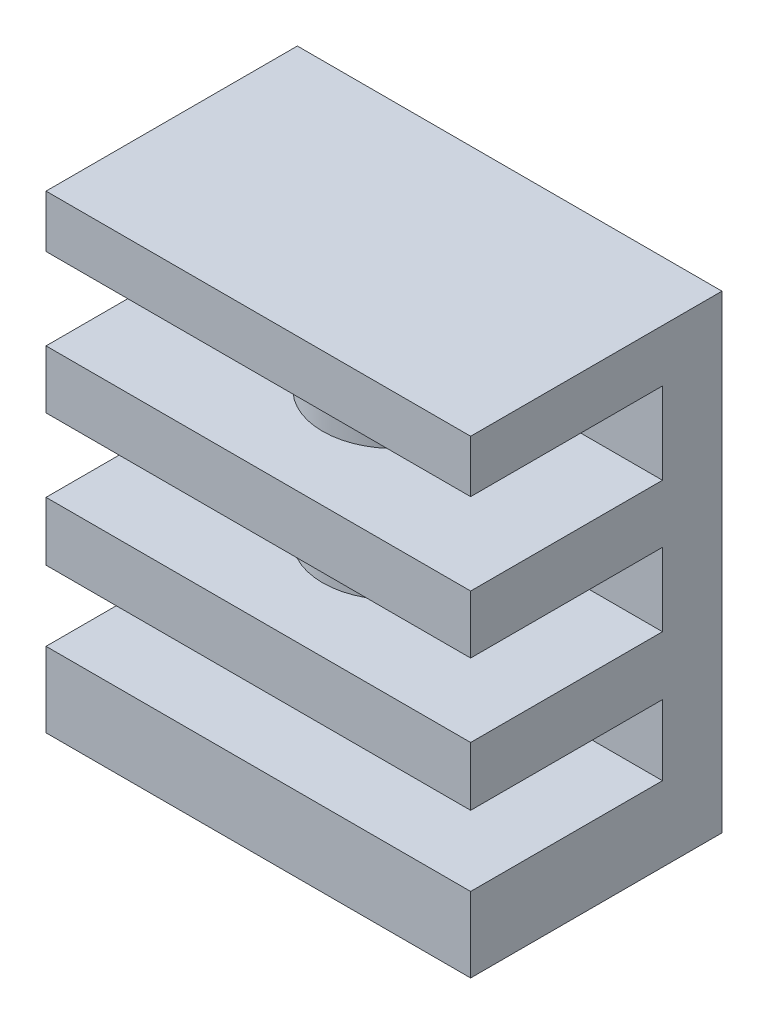
ISO-10303-21;
HEADER;
FILE_DESCRIPTION(('STEP AP214'),'2;1');
FILE_NAME('part.step','',(''),(''),'','','');
FILE_SCHEMA(('AUTOMOTIVE_DESIGN { 1 0 10303 214 1 1 1 1 }'));
ENDSEC;
DATA;
#1=APPLICATION_CONTEXT('core data for automotive mechanical design processes');
#2=APPLICATION_PROTOCOL_DEFINITION('international standard','automotive_design',2000,#1);
#3=PRODUCT_CONTEXT('',#1,'mechanical');
#4=PRODUCT('Part','Part','',(#3));
#5=PRODUCT_RELATED_PRODUCT_CATEGORY('part','',(#4));
#6=PRODUCT_DEFINITION_FORMATION('','',#4);
#7=PRODUCT_DEFINITION_CONTEXT('part definition',#1,'design');
#8=PRODUCT_DEFINITION('design','',#6,#7);
#9=PRODUCT_DEFINITION_SHAPE('','',#8);
#10=(LENGTH_UNIT() NAMED_UNIT(*) SI_UNIT(.MILLI.,.METRE.));
#11=(NAMED_UNIT(*) PLANE_ANGLE_UNIT() SI_UNIT($,.RADIAN.));
#12=(NAMED_UNIT(*) SI_UNIT($,.STERADIAN.) SOLID_ANGLE_UNIT());
#13=UNCERTAINTY_MEASURE_WITH_UNIT(LENGTH_MEASURE(1.E-05),#10,'distance_accuracy_value','');
#14=(GEOMETRIC_REPRESENTATION_CONTEXT(3) GLOBAL_UNCERTAINTY_ASSIGNED_CONTEXT((#13)) GLOBAL_UNIT_ASSIGNED_CONTEXT((#10,
#11,#12)) REPRESENTATION_CONTEXT('',''));
#15=CARTESIAN_POINT('',(0.,0.,0.));
#16=DIRECTION('',(0.,0.,1.));
#17=DIRECTION('',(1.,0.,0.));
#18=AXIS2_PLACEMENT_3D('',#15,#16,#17);
#19=CARTESIAN_POINT('',(50.,98.1729716189501,-45.177222912312));
#20=DIRECTION('',(0.,0.,-1.));
#21=DIRECTION('',(-1.,0.,0.));
#22=AXIS2_PLACEMENT_3D('',#19,#20,#21);
#23=PLANE('',#22);
#24=DIRECTION('',(-1.,0.,0.));
#25=VECTOR('',#24,1.);
#26=CARTESIAN_POINT('',(50.,78.9291415262313,-45.177222912312));
#27=LINE('',#26,#25);
#28=CARTESIAN_POINT('',(-10.5940601891332,78.9291415262313,-45.177222912312));
#29=VERTEX_POINT('',#28);
#30=CARTESIAN_POINT('',(-50.,78.9291415262313,-45.177222912312));
#31=VERTEX_POINT('',#30);
#32=EDGE_CURVE('E219',#29,#31,#27,.T.);
#33=ORIENTED_EDGE('',*,*,#32,.F.);
#34=DIRECTION('',(0.,1.,0.));
#35=VECTOR('',#34,1.);
#36=CARTESIAN_POINT('',(-10.5940601891332,48.0377300616038,-45.177222912312));
#37=LINE('',#36,#35);
#38=CARTESIAN_POINT('',(-10.5940601891332,98.1729716189501,-45.177222912312));
#39=VERTEX_POINT('',#38);
#40=EDGE_CURVE('E59',#29,#39,#37,.T.);
#41=ORIENTED_EDGE('',*,*,#40,.T.);
#42=DIRECTION('',(-1.,0.,0.));
#43=VECTOR('',#42,1.);
#44=CARTESIAN_POINT('',(50.,98.1729716189501,-45.177222912312));
#45=LINE('',#44,#43);
#46=CARTESIAN_POINT('',(-50.,98.1729716189501,-45.177222912312));
#47=VERTEX_POINT('',#46);
#48=EDGE_CURVE('E224',#39,#47,#45,.T.);
#49=ORIENTED_EDGE('',*,*,#48,.T.);
#50=DIRECTION('',(0.,-1.,0.));
#51=VECTOR('',#50,1.);
#52=CARTESIAN_POINT('',(-50.,98.1729716189501,-45.177222912312));
#53=LINE('',#52,#51);
#54=EDGE_CURVE('E288',#47,#31,#53,.T.);
#55=ORIENTED_EDGE('',*,*,#54,.T.);
#56=EDGE_LOOP('',(#33,#41,#49,#55));
#57=FACE_BOUND('',#56,.T.);
#58=ADVANCED_FACE('F43',(#57),#23,.F.);
#59=CARTESIAN_POINT('',(50.,65.2558938287732,-45.177222912312));
#60=DIRECTION('',(0.,0.,-1.));
#61=DIRECTION('',(-1.,0.,0.));
#62=AXIS2_PLACEMENT_3D('',#59,#60,#61);
#63=PLANE('',#62);
#64=DIRECTION('',(-1.,0.,0.));
#65=VECTOR('',#64,1.);
#66=CARTESIAN_POINT('',(50.,48.0377300616038,-45.177222912312));
#67=LINE('',#66,#65);
#68=CARTESIAN_POINT('',(-10.5940601891332,48.0377300616038,-45.177222912312));
#69=VERTEX_POINT('',#68);
#70=CARTESIAN_POINT('',(-50.,48.0377300616038,-45.177222912312));
#71=VERTEX_POINT('',#70);
#72=EDGE_CURVE('E201',#69,#71,#67,.T.);
#73=ORIENTED_EDGE('',*,*,#72,.F.);
#74=DIRECTION('',(0.,1.,0.));
#75=VECTOR('',#74,1.);
#76=CARTESIAN_POINT('',(-10.5940601891332,48.0377300616038,-45.177222912312));
#77=LINE('',#76,#75);
#78=CARTESIAN_POINT('',(-10.5940601891332,65.2558938287732,-45.177222912312));
#79=VERTEX_POINT('',#78);
#80=EDGE_CURVE('E67',#69,#79,#77,.T.);
#81=ORIENTED_EDGE('',*,*,#80,.T.);
#82=DIRECTION('',(-1.,0.,0.));
#83=VECTOR('',#82,1.);
#84=CARTESIAN_POINT('',(50.,65.2558938287732,-45.177222912312));
#85=LINE('',#84,#83);
#86=CARTESIAN_POINT('',(-50.,65.2558938287732,-45.177222912312));
#87=VERTEX_POINT('',#86);
#88=EDGE_CURVE('E200',#79,#87,#85,.T.);
#89=ORIENTED_EDGE('',*,*,#88,.T.);
#90=DIRECTION('',(0.,-1.,0.));
#91=VECTOR('',#90,1.);
#92=CARTESIAN_POINT('',(-50.,65.2558938287732,-45.177222912312));
#93=LINE('',#92,#91);
#94=EDGE_CURVE('E302',#87,#71,#93,.T.);
#95=ORIENTED_EDGE('',*,*,#94,.T.);
#96=EDGE_LOOP('',(#73,#81,#89,#95));
#97=FACE_BOUND('',#96,.T.);
#98=ADVANCED_FACE('F416',(#97),#63,.F.);
#99=CARTESIAN_POINT('',(50.,17.6527351783636,0.));
#100=DIRECTION('',(0.,0.,-1.));
#101=DIRECTION('',(-1.,0.,0.));
#102=AXIS2_PLACEMENT_3D('',#99,#100,#101);
#103=PLANE('',#102);
#104=DIRECTION('',(0.,-1.,0.));
#105=VECTOR('',#104,1.);
#106=CARTESIAN_POINT('',(-50.,17.6527351783636,0.));
#107=LINE('',#106,#105);
#108=CARTESIAN_POINT('',(-50.,17.6527351783636,0.));
#109=VERTEX_POINT('',#108);
#110=CARTESIAN_POINT('',(-50.,0.,0.));
#111=VERTEX_POINT('',#110);
#112=EDGE_CURVE('E258',#109,#111,#107,.T.);
#113=ORIENTED_EDGE('',*,*,#112,.T.);
#114=DIRECTION('',(-1.,0.,0.));
#115=VECTOR('',#114,1.);
#116=CARTESIAN_POINT('',(50.,0.,0.));
#117=LINE('',#116,#115);
#118=CARTESIAN_POINT('',(50.,0.,0.));
#119=VERTEX_POINT('',#118);
#120=EDGE_CURVE('E52',#119,#111,#117,.T.);
#121=ORIENTED_EDGE('',*,*,#120,.F.);
#122=DIRECTION('',(0.,-1.,0.));
#123=VECTOR('',#122,1.);
#124=CARTESIAN_POINT('',(50.,17.6527351783636,0.));
#125=LINE('',#124,#123);
#126=CARTESIAN_POINT('',(50.,17.6527351783636,0.));
#127=VERTEX_POINT('',#126);
#128=EDGE_CURVE('E321',#127,#119,#125,.T.);
#129=ORIENTED_EDGE('',*,*,#128,.F.);
#130=DIRECTION('',(-1.,0.,0.));
#131=VECTOR('',#130,1.);
#132=CARTESIAN_POINT('',(50.,17.6527351783636,0.));
#133=LINE('',#132,#131);
#134=EDGE_CURVE('E260',#127,#109,#133,.T.);
#135=ORIENTED_EDGE('',*,*,#134,.T.);
#136=EDGE_LOOP('',(#113,#121,#129,#135));
#137=FACE_BOUND('',#136,.T.);
#138=ADVANCED_FACE('F45',(#137),#103,.F.);
#139=CARTESIAN_POINT('',(50.,0.,0.));
#140=DIRECTION('',(0.,1.,0.));
#141=DIRECTION('',(0.,0.,1.));
#142=AXIS2_PLACEMENT_3D('',#139,#140,#141);
#143=PLANE('',#142);
#144=DIRECTION('',(0.,0.,-1.));
#145=VECTOR('',#144,1.);
#146=CARTESIAN_POINT('',(-50.,0.,0.));
#147=LINE('',#146,#145);
#148=CARTESIAN_POINT('',(-50.,0.,-59.1880816640283));
#149=VERTEX_POINT('',#148);
#150=EDGE_CURVE('E251',#111,#149,#147,.T.);
#151=ORIENTED_EDGE('',*,*,#150,.T.);
#152=DIRECTION('',(-1.,0.,0.));
#153=VECTOR('',#152,1.);
#154=CARTESIAN_POINT('',(50.,0.,-59.1880816640283));
#155=LINE('',#154,#153);
#156=CARTESIAN_POINT('',(50.,0.,-59.1880816640283));
#157=VERTEX_POINT('',#156);
#158=EDGE_CURVE('E241',#157,#149,#155,.T.);
#159=ORIENTED_EDGE('',*,*,#158,.F.);
#160=DIRECTION('',(0.,0.,-1.));
#161=VECTOR('',#160,1.);
#162=CARTESIAN_POINT('',(50.,0.,0.));
#163=LINE('',#162,#161);
#164=EDGE_CURVE('E252',#119,#157,#163,.T.);
#165=ORIENTED_EDGE('',*,*,#164,.F.);
#166=ORIENTED_EDGE('',*,*,#120,.T.);
#167=EDGE_LOOP('',(#151,#159,#165,#166));
#168=FACE_BOUND('',#167,.T.);
#169=ADVANCED_FACE('F249',(#168),#143,.F.);
#170=CARTESIAN_POINT('',(50.,0.,-59.1880816640283));
#171=DIRECTION('',(0.,0.,1.));
#172=DIRECTION('',(1.,0.,0.));
#173=AXIS2_PLACEMENT_3D('',#170,#171,#172);
#174=PLANE('',#173);
#175=DIRECTION('',(0.,1.,0.));
#176=VECTOR('',#175,1.);
#177=CARTESIAN_POINT('',(-50.,0.,-59.1880816640283));
#178=LINE('',#177,#176);
#179=CARTESIAN_POINT('',(-50.,110.495775099375,-59.1880816640283));
#180=VERTEX_POINT('',#179);
#181=EDGE_CURVE('E268',#149,#180,#178,.T.);
#182=ORIENTED_EDGE('',*,*,#181,.T.);
#183=DIRECTION('',(-1.,0.,0.));
#184=VECTOR('',#183,1.);
#185=CARTESIAN_POINT('',(50.,110.495775099375,-59.1880816640283));
#186=LINE('',#185,#184);
#187=CARTESIAN_POINT('',(50.,110.495775099375,-59.1880816640283));
#188=VERTEX_POINT('',#187);
#189=EDGE_CURVE('E237',#188,#180,#186,.T.);
#190=ORIENTED_EDGE('',*,*,#189,.F.);
#191=DIRECTION('',(0.,1.,0.));
#192=VECTOR('',#191,1.);
#193=CARTESIAN_POINT('',(50.,0.,-59.1880816640283));
#194=LINE('',#193,#192);
#195=EDGE_CURVE('E392',#157,#188,#194,.T.);
#196=ORIENTED_EDGE('',*,*,#195,.F.);
#197=ORIENTED_EDGE('',*,*,#158,.T.);
#198=EDGE_LOOP('',(#182,#190,#196,#197));
#199=FACE_BOUND('',#198,.T.);
#200=ADVANCED_FACE('F452',(#199),#174,.F.);
#201=CARTESIAN_POINT('',(50.,110.495775099375,-59.1880816640283));
#202=DIRECTION('',(0.,-1.,0.));
#203=DIRECTION('',(0.,0.,-1.));
#204=AXIS2_PLACEMENT_3D('',#201,#202,#203);
#205=PLANE('',#204);
#206=DIRECTION('',(0.,0.,1.));
#207=VECTOR('',#206,1.);
#208=CARTESIAN_POINT('',(-50.,110.495775099375,-59.1880816640283));
#209=LINE('',#208,#207);
#210=CARTESIAN_POINT('',(-50.,110.495775099375,0.));
#211=VERTEX_POINT('',#210);
#212=EDGE_CURVE('E278',#180,#211,#209,.T.);
#213=ORIENTED_EDGE('',*,*,#212,.T.);
#214=DIRECTION('',(-1.,0.,0.));
#215=VECTOR('',#214,1.);
#216=CARTESIAN_POINT('',(50.,110.495775099375,0.));
#217=LINE('',#216,#215);
#218=CARTESIAN_POINT('',(50.,110.495775099375,0.));
#219=VERTEX_POINT('',#218);
#220=EDGE_CURVE('E233',#219,#211,#217,.T.);
#221=ORIENTED_EDGE('',*,*,#220,.F.);
#222=DIRECTION('',(0.,0.,1.));
#223=VECTOR('',#222,1.);
#224=CARTESIAN_POINT('',(50.,110.495775099375,-59.1880816640283));
#225=LINE('',#224,#223);
#226=EDGE_CURVE('E389',#188,#219,#225,.T.);
#227=ORIENTED_EDGE('',*,*,#226,.F.);
#228=ORIENTED_EDGE('',*,*,#189,.T.);
#229=EDGE_LOOP('',(#213,#221,#227,#228));
#230=FACE_BOUND('',#229,.T.);
#231=ADVANCED_FACE('F447',(#230),#205,.F.);
#232=CARTESIAN_POINT('',(50.,110.495775099375,0.));
#233=DIRECTION('',(0.,0.,-1.));
#234=DIRECTION('',(-1.,0.,0.));
#235=AXIS2_PLACEMENT_3D('',#232,#233,#234);
#236=PLANE('',#235);
#237=DIRECTION('',(0.,-1.,0.));
#238=VECTOR('',#237,1.);
#239=CARTESIAN_POINT('',(-50.,110.495775099375,0.));
#240=LINE('',#239,#238);
#241=CARTESIAN_POINT('',(-50.,98.1729716189501,0.));
#242=VERTEX_POINT('',#241);
#243=EDGE_CURVE('E281',#211,#242,#240,.T.);
#244=ORIENTED_EDGE('',*,*,#243,.T.);
#245=DIRECTION('',(-1.,0.,0.));
#246=VECTOR('',#245,1.);
#247=CARTESIAN_POINT('',(50.,98.1729716189501,0.));
#248=LINE('',#247,#246);
#249=CARTESIAN_POINT('',(50.,98.1729716189501,0.));
#250=VERTEX_POINT('',#249);
#251=EDGE_CURVE('E229',#250,#242,#248,.T.);
#252=ORIENTED_EDGE('',*,*,#251,.F.);
#253=DIRECTION('',(0.,-1.,0.));
#254=VECTOR('',#253,1.);
#255=CARTESIAN_POINT('',(50.,110.495775099375,0.));
#256=LINE('',#255,#254);
#257=EDGE_CURVE('E386',#219,#250,#256,.T.);
#258=ORIENTED_EDGE('',*,*,#257,.F.);
#259=ORIENTED_EDGE('',*,*,#220,.T.);
#260=EDGE_LOOP('',(#244,#252,#258,#259));
#261=FACE_BOUND('',#260,.T.);
#262=ADVANCED_FACE('F442',(#261),#236,.F.);
#263=CARTESIAN_POINT('',(50.,98.1729716189501,0.));
#264=DIRECTION('',(0.,1.,0.));
#265=DIRECTION('',(0.,0.,1.));
#266=AXIS2_PLACEMENT_3D('',#263,#264,#265);
#267=PLANE('',#266);
#268=ORIENTED_EDGE('',*,*,#48,.F.);
#269=CARTESIAN_POINT('',(0.,98.1729716189501,-32.021799431723));
#270=DIRECTION('',(0.,1.,0.));
#271=DIRECTION('',(0.,0.,1.));
#272=AXIS2_PLACEMENT_3D('',#269,#270,#271);
#273=CIRCLE('',#272,16.8908045469896);
#274=CARTESIAN_POINT('',(10.5940601891332,98.1729716189501,-45.177222912312));
#275=VERTEX_POINT('',#274);
#276=EDGE_CURVE('E264',#39,#275,#273,.T.);
#277=ORIENTED_EDGE('',*,*,#276,.T.);
#278=CARTESIAN_POINT('',(50.,98.1729716189501,-45.177222912312));
#279=VERTEX_POINT('',#278);
#280=EDGE_CURVE('E225',#279,#275,#45,.T.);
#281=ORIENTED_EDGE('',*,*,#280,.F.);
#282=DIRECTION('',(0.,0.,-1.));
#283=VECTOR('',#282,1.);
#284=CARTESIAN_POINT('',(50.,98.1729716189501,0.));
#285=LINE('',#284,#283);
#286=EDGE_CURVE('E383',#250,#279,#285,.T.);
#287=ORIENTED_EDGE('',*,*,#286,.F.);
#288=ORIENTED_EDGE('',*,*,#251,.T.);
#289=DIRECTION('',(0.,0.,-1.));
#290=VECTOR('',#289,1.);
#291=CARTESIAN_POINT('',(-50.,98.1729716189501,0.));
#292=LINE('',#291,#290);
#293=EDGE_CURVE('E284',#242,#47,#292,.T.);
#294=ORIENTED_EDGE('',*,*,#293,.T.);
#295=EDGE_LOOP('',(#268,#277,#281,#287,#288,#294));
#296=FACE_BOUND('',#295,.T.);
#297=ADVANCED_FACE('F436',(#296),#267,.F.);
#298=ORIENTED_EDGE('',*,*,#280,.T.);
#299=DIRECTION('',(0.,1.,0.));
#300=VECTOR('',#299,1.);
#301=CARTESIAN_POINT('',(10.5940601891332,48.0377300616038,-45.177222912312));
#302=LINE('',#301,#300);
#303=CARTESIAN_POINT('',(10.5940601891332,78.9291415262313,-45.177222912312));
#304=VERTEX_POINT('',#303);
#305=EDGE_CURVE('E401',#275,#304,#302,.F.);
#306=ORIENTED_EDGE('',*,*,#305,.T.);
#307=CARTESIAN_POINT('',(50.,78.9291415262313,-45.177222912312));
#308=VERTEX_POINT('',#307);
#309=EDGE_CURVE('E220',#308,#304,#27,.T.);
#310=ORIENTED_EDGE('',*,*,#309,.F.);
#311=DIRECTION('',(0.,-1.,0.));
#312=VECTOR('',#311,1.);
#313=CARTESIAN_POINT('',(50.,98.1729716189501,-45.177222912312));
#314=LINE('',#313,#312);
#315=EDGE_CURVE('E380',#279,#308,#314,.T.);
#316=ORIENTED_EDGE('',*,*,#315,.F.);
#317=EDGE_LOOP('',(#298,#306,#310,#316));
#318=FACE_BOUND('',#317,.T.);
#319=ADVANCED_FACE('F467',(#318),#23,.F.);
#320=CARTESIAN_POINT('',(50.,78.9291415262313,-45.177222912312));
#321=DIRECTION('',(0.,-1.,0.));
#322=DIRECTION('',(0.,0.,-1.));
#323=AXIS2_PLACEMENT_3D('',#320,#321,#322);
#324=PLANE('',#323);
#325=ORIENTED_EDGE('',*,*,#309,.T.);
#326=CARTESIAN_POINT('',(0.,78.9291415262313,-32.021799431723));
#327=DIRECTION('',(0.,-1.,0.));
#328=DIRECTION('',(0.,0.,-1.));
#329=AXIS2_PLACEMENT_3D('',#326,#327,#328);
#330=CIRCLE('',#329,16.8908045469896);
#331=EDGE_CURVE('E405',#304,#29,#330,.T.);
#332=ORIENTED_EDGE('',*,*,#331,.T.);
#333=ORIENTED_EDGE('',*,*,#32,.T.);
#334=DIRECTION('',(0.,0.,1.));
#335=VECTOR('',#334,1.);
#336=CARTESIAN_POINT('',(-50.,78.9291415262313,-45.177222912312));
#337=LINE('',#336,#335);
#338=CARTESIAN_POINT('',(-50.,78.9291415262313,0.));
#339=VERTEX_POINT('',#338);
#340=EDGE_CURVE('E292',#31,#339,#337,.T.);
#341=ORIENTED_EDGE('',*,*,#340,.T.);
#342=DIRECTION('',(-1.,0.,0.));
#343=VECTOR('',#342,1.);
#344=CARTESIAN_POINT('',(50.,78.9291415262313,0.));
#345=LINE('',#344,#343);
#346=CARTESIAN_POINT('',(50.,78.9291415262313,0.));
#347=VERTEX_POINT('',#346);
#348=EDGE_CURVE('E215',#347,#339,#345,.T.);
#349=ORIENTED_EDGE('',*,*,#348,.F.);
#350=DIRECTION('',(0.,0.,1.));
#351=VECTOR('',#350,1.);
#352=CARTESIAN_POINT('',(50.,78.9291415262313,-45.177222912312));
#353=LINE('',#352,#351);
#354=EDGE_CURVE('E377',#308,#347,#353,.T.);
#355=ORIENTED_EDGE('',*,*,#354,.F.);
#356=EDGE_LOOP('',(#325,#332,#333,#341,#349,#355));
#357=FACE_BOUND('',#356,.T.);
#358=ADVANCED_FACE('F427',(#357),#324,.F.);
#359=CARTESIAN_POINT('',(50.,78.9291415262313,0.));
#360=DIRECTION('',(0.,0.,-1.));
#361=DIRECTION('',(-1.,0.,0.));
#362=AXIS2_PLACEMENT_3D('',#359,#360,#361);
#363=PLANE('',#362);
#364=DIRECTION('',(0.,-1.,0.));
#365=VECTOR('',#364,1.);
#366=CARTESIAN_POINT('',(-50.,78.9291415262313,0.));
#367=LINE('',#366,#365);
#368=CARTESIAN_POINT('',(-50.,65.2558938287732,0.));
#369=VERTEX_POINT('',#368);
#370=EDGE_CURVE('E295',#339,#369,#367,.T.);
#371=ORIENTED_EDGE('',*,*,#370,.T.);
#372=DIRECTION('',(-1.,0.,0.));
#373=VECTOR('',#372,1.);
#374=CARTESIAN_POINT('',(50.,65.2558938287732,0.));
#375=LINE('',#374,#373);
#376=CARTESIAN_POINT('',(50.,65.2558938287732,0.));
#377=VERTEX_POINT('',#376);
#378=EDGE_CURVE('E211',#377,#369,#375,.T.);
#379=ORIENTED_EDGE('',*,*,#378,.F.);
#380=DIRECTION('',(0.,-1.,0.));
#381=VECTOR('',#380,1.);
#382=CARTESIAN_POINT('',(50.,78.9291415262313,0.));
#383=LINE('',#382,#381);
#384=EDGE_CURVE('E374',#347,#377,#383,.T.);
#385=ORIENTED_EDGE('',*,*,#384,.F.);
#386=ORIENTED_EDGE('',*,*,#348,.T.);
#387=EDGE_LOOP('',(#371,#379,#385,#386));
#388=FACE_BOUND('',#387,.T.);
#389=ADVANCED_FACE('F423',(#388),#363,.F.);
#390=CARTESIAN_POINT('',(50.,65.2558938287732,0.));
#391=DIRECTION('',(0.,1.,0.));
#392=DIRECTION('',(0.,0.,1.));
#393=AXIS2_PLACEMENT_3D('',#390,#391,#392);
#394=PLANE('',#393);
#395=ORIENTED_EDGE('',*,*,#88,.F.);
#396=CARTESIAN_POINT('',(0.,65.2558938287732,-32.021799431723));
#397=DIRECTION('',(0.,1.,0.));
#398=DIRECTION('',(0.,0.,1.));
#399=AXIS2_PLACEMENT_3D('',#396,#397,#398);
#400=CIRCLE('',#399,16.8908045469896);
#401=CARTESIAN_POINT('',(10.5940601891332,65.2558938287732,-45.177222912312));
#402=VERTEX_POINT('',#401);
#403=EDGE_CURVE('E194',#79,#402,#400,.T.);
#404=ORIENTED_EDGE('',*,*,#403,.T.);
#405=CARTESIAN_POINT('',(50.,65.2558938287732,-45.177222912312));
#406=VERTEX_POINT('',#405);
#407=EDGE_CURVE('E192',#406,#402,#85,.T.);
#408=ORIENTED_EDGE('',*,*,#407,.F.);
#409=DIRECTION('',(0.,0.,-1.));
#410=VECTOR('',#409,1.);
#411=CARTESIAN_POINT('',(50.,65.2558938287732,0.));
#412=LINE('',#411,#410);
#413=EDGE_CURVE('E371',#377,#406,#412,.T.);
#414=ORIENTED_EDGE('',*,*,#413,.F.);
#415=ORIENTED_EDGE('',*,*,#378,.T.);
#416=DIRECTION('',(0.,0.,-1.));
#417=VECTOR('',#416,1.);
#418=CARTESIAN_POINT('',(-50.,65.2558938287732,0.));
#419=LINE('',#418,#417);
#420=EDGE_CURVE('E298',#369,#87,#419,.T.);
#421=ORIENTED_EDGE('',*,*,#420,.T.);
#422=EDGE_LOOP('',(#395,#404,#408,#414,#415,#421));
#423=FACE_BOUND('',#422,.T.);
#424=ADVANCED_FACE('F413',(#423),#394,.F.);
#425=ORIENTED_EDGE('',*,*,#407,.T.);
#426=DIRECTION('',(0.,1.,0.));
#427=VECTOR('',#426,1.);
#428=CARTESIAN_POINT('',(10.5940601891332,48.0377300616038,-45.177222912312));
#429=LINE('',#428,#427);
#430=CARTESIAN_POINT('',(10.5940601891332,48.0377300616038,-45.177222912312));
#431=VERTEX_POINT('',#430);
#432=EDGE_CURVE('E179',#402,#431,#429,.F.);
#433=ORIENTED_EDGE('',*,*,#432,.T.);
#434=CARTESIAN_POINT('',(50.,48.0377300616038,-45.177222912312));
#435=VERTEX_POINT('',#434);
#436=EDGE_CURVE('E189',#435,#431,#67,.T.);
#437=ORIENTED_EDGE('',*,*,#436,.F.);
#438=DIRECTION('',(0.,-1.,0.));
#439=VECTOR('',#438,1.);
#440=CARTESIAN_POINT('',(50.,65.2558938287732,-45.177222912312));
#441=LINE('',#440,#439);
#442=EDGE_CURVE('E368',#406,#435,#441,.T.);
#443=ORIENTED_EDGE('',*,*,#442,.F.);
#444=EDGE_LOOP('',(#425,#433,#437,#443));
#445=FACE_BOUND('',#444,.T.);
#446=ADVANCED_FACE('F187',(#445),#63,.F.);
#447=CARTESIAN_POINT('',(50.,48.0377300616038,-45.177222912312));
#448=DIRECTION('',(0.,-1.,0.));
#449=DIRECTION('',(0.,0.,-1.));
#450=AXIS2_PLACEMENT_3D('',#447,#448,#449);
#451=PLANE('',#450);
#452=ORIENTED_EDGE('',*,*,#436,.T.);
#453=CARTESIAN_POINT('',(0.,48.0377300616038,-32.021799431723));
#454=DIRECTION('',(0.,-1.,0.));
#455=DIRECTION('',(0.,0.,-1.));
#456=AXIS2_PLACEMENT_3D('',#453,#454,#455);
#457=CIRCLE('',#456,16.8908045469896);
#458=EDGE_CURVE('E11',#431,#69,#457,.T.);
#459=ORIENTED_EDGE('',*,*,#458,.T.);
#460=ORIENTED_EDGE('',*,*,#72,.T.);
#461=DIRECTION('',(0.,0.,1.));
#462=VECTOR('',#461,1.);
#463=CARTESIAN_POINT('',(-50.,48.0377300616038,-45.177222912312));
#464=LINE('',#463,#462);
#465=CARTESIAN_POINT('',(-50.,48.0377300616038,0.));
#466=VERTEX_POINT('',#465);
#467=EDGE_CURVE('E306',#71,#466,#464,.T.);
#468=ORIENTED_EDGE('',*,*,#467,.T.);
#469=DIRECTION('',(-1.,0.,0.));
#470=VECTOR('',#469,1.);
#471=CARTESIAN_POINT('',(50.,48.0377300616038,0.));
#472=LINE('',#471,#470);
#473=CARTESIAN_POINT('',(50.,48.0377300616038,0.));
#474=VERTEX_POINT('',#473);
#475=EDGE_CURVE('E206',#474,#466,#472,.T.);
#476=ORIENTED_EDGE('',*,*,#475,.F.);
#477=DIRECTION('',(0.,0.,1.));
#478=VECTOR('',#477,1.);
#479=CARTESIAN_POINT('',(50.,48.0377300616038,-45.177222912312));
#480=LINE('',#479,#478);
#481=EDGE_CURVE('E198',#435,#474,#480,.T.);
#482=ORIENTED_EDGE('',*,*,#481,.F.);
#483=EDGE_LOOP('',(#452,#459,#460,#468,#476,#482));
#484=FACE_BOUND('',#483,.T.);
#485=ADVANCED_FACE('F196',(#484),#451,.F.);
#486=CARTESIAN_POINT('',(50.,48.0377300616038,0.));
#487=DIRECTION('',(0.,0.,-1.));
#488=DIRECTION('',(-1.,0.,0.));
#489=AXIS2_PLACEMENT_3D('',#486,#487,#488);
#490=PLANE('',#489);
#491=DIRECTION('',(0.,-1.,0.));
#492=VECTOR('',#491,1.);
#493=CARTESIAN_POINT('',(-50.,48.0377300616038,0.));
#494=LINE('',#493,#492);
#495=CARTESIAN_POINT('',(-50.,34.1956768370166,0.));
#496=VERTEX_POINT('',#495);
#497=EDGE_CURVE('E309',#466,#496,#494,.T.);
#498=ORIENTED_EDGE('',*,*,#497,.T.);
#499=DIRECTION('',(-1.,0.,0.));
#500=VECTOR('',#499,1.);
#501=CARTESIAN_POINT('',(50.,34.1956768370166,0.));
#502=LINE('',#501,#500);
#503=CARTESIAN_POINT('',(50.,34.1956768370166,0.));
#504=VERTEX_POINT('',#503);
#505=EDGE_CURVE('E331',#504,#496,#502,.T.);
#506=ORIENTED_EDGE('',*,*,#505,.F.);
#507=DIRECTION('',(0.,-1.,0.));
#508=VECTOR('',#507,1.);
#509=CARTESIAN_POINT('',(50.,48.0377300616038,0.));
#510=LINE('',#509,#508);
#511=EDGE_CURVE('E344',#474,#504,#510,.T.);
#512=ORIENTED_EDGE('',*,*,#511,.F.);
#513=ORIENTED_EDGE('',*,*,#475,.T.);
#514=EDGE_LOOP('',(#498,#506,#512,#513));
#515=FACE_BOUND('',#514,.T.);
#516=ADVANCED_FACE('F343',(#515),#490,.F.);
#517=CARTESIAN_POINT('',(50.,34.1956768370166,0.));
#518=DIRECTION('',(0.,1.,0.));
#519=DIRECTION('',(0.,0.,1.));
#520=AXIS2_PLACEMENT_3D('',#517,#518,#519);
#521=PLANE('',#520);
#522=DIRECTION('',(0.,0.,-1.));
#523=VECTOR('',#522,1.);
#524=CARTESIAN_POINT('',(-50.,34.1956768370166,0.));
#525=LINE('',#524,#523);
#526=CARTESIAN_POINT('',(-50.,34.1956768370166,-45.177222912312));
#527=VERTEX_POINT('',#526);
#528=EDGE_CURVE('E312',#496,#527,#525,.T.);
#529=ORIENTED_EDGE('',*,*,#528,.T.);
#530=DIRECTION('',(-1.,0.,0.));
#531=VECTOR('',#530,1.);
#532=CARTESIAN_POINT('',(50.,34.1956768370166,-45.177222912312));
#533=LINE('',#532,#531);
#534=CARTESIAN_POINT('',(50.,34.1956768370166,-45.177222912312));
#535=VERTEX_POINT('',#534);
#536=EDGE_CURVE('E328',#535,#527,#533,.T.);
#537=ORIENTED_EDGE('',*,*,#536,.F.);
#538=DIRECTION('',(0.,0.,-1.));
#539=VECTOR('',#538,1.);
#540=CARTESIAN_POINT('',(50.,34.1956768370166,0.));
#541=LINE('',#540,#539);
#542=EDGE_CURVE('E359',#504,#535,#541,.T.);
#543=ORIENTED_EDGE('',*,*,#542,.F.);
#544=ORIENTED_EDGE('',*,*,#505,.T.);
#545=EDGE_LOOP('',(#529,#537,#543,#544));
#546=FACE_BOUND('',#545,.T.);
#547=ADVANCED_FACE('F350',(#546),#521,.F.);
#548=CARTESIAN_POINT('',(50.,34.1956768370166,-45.177222912312));
#549=DIRECTION('',(0.,0.,-1.));
#550=DIRECTION('',(-1.,0.,0.));
#551=AXIS2_PLACEMENT_3D('',#548,#549,#550);
#552=PLANE('',#551);
#553=DIRECTION('',(0.,-1.,0.));
#554=VECTOR('',#553,1.);
#555=CARTESIAN_POINT('',(-50.,34.1956768370166,-45.177222912312));
#556=LINE('',#555,#554);
#557=CARTESIAN_POINT('',(-50.,17.6527351783636,-45.177222912312));
#558=VERTEX_POINT('',#557);
#559=EDGE_CURVE('E315',#527,#558,#556,.T.);
#560=ORIENTED_EDGE('',*,*,#559,.T.);
#561=DIRECTION('',(-1.,0.,0.));
#562=VECTOR('',#561,1.);
#563=CARTESIAN_POINT('',(50.,17.6527351783636,-45.177222912312));
#564=LINE('',#563,#562);
#565=CARTESIAN_POINT('',(50.,17.6527351783636,-45.177222912312));
#566=VERTEX_POINT('',#565);
#567=EDGE_CURVE('E324',#566,#558,#564,.T.);
#568=ORIENTED_EDGE('',*,*,#567,.F.);
#569=DIRECTION('',(0.,-1.,0.));
#570=VECTOR('',#569,1.);
#571=CARTESIAN_POINT('',(50.,34.1956768370166,-45.177222912312));
#572=LINE('',#571,#570);
#573=EDGE_CURVE('E355',#535,#566,#572,.T.);
#574=ORIENTED_EDGE('',*,*,#573,.F.);
#575=ORIENTED_EDGE('',*,*,#536,.T.);
#576=EDGE_LOOP('',(#560,#568,#574,#575));
#577=FACE_BOUND('',#576,.T.);
#578=ADVANCED_FACE('F353',(#577),#552,.F.);
#579=CARTESIAN_POINT('',(50.,17.6527351783636,-45.177222912312));
#580=DIRECTION('',(0.,-1.,0.));
#581=DIRECTION('',(0.,0.,-1.));
#582=AXIS2_PLACEMENT_3D('',#579,#580,#581);
#583=PLANE('',#582);
#584=DIRECTION('',(0.,0.,1.));
#585=VECTOR('',#584,1.);
#586=CARTESIAN_POINT('',(-50.,17.6527351783636,-45.177222912312));
#587=LINE('',#586,#585);
#588=EDGE_CURVE('E318',#558,#109,#587,.T.);
#589=ORIENTED_EDGE('',*,*,#588,.T.);
#590=ORIENTED_EDGE('',*,*,#134,.F.);
#591=DIRECTION('',(0.,0.,1.));
#592=VECTOR('',#591,1.);
#593=CARTESIAN_POINT('',(50.,17.6527351783636,-45.177222912312));
#594=LINE('',#593,#592);
#595=EDGE_CURVE('E273',#566,#127,#594,.T.);
#596=ORIENTED_EDGE('',*,*,#595,.F.);
#597=ORIENTED_EDGE('',*,*,#567,.T.);
#598=EDGE_LOOP('',(#589,#590,#596,#597));
#599=FACE_BOUND('',#598,.T.);
#600=ADVANCED_FACE('F455',(#599),#583,.F.);
#601=CARTESIAN_POINT('',(50.,0.,0.));
#602=DIRECTION('',(1.,0.,0.));
#603=DIRECTION('',(0.,0.,-1.));
#604=AXIS2_PLACEMENT_3D('',#601,#602,#603);
#605=PLANE('',#604);
#606=ORIENTED_EDGE('',*,*,#128,.T.);
#607=ORIENTED_EDGE('',*,*,#164,.T.);
#608=ORIENTED_EDGE('',*,*,#195,.T.);
#609=ORIENTED_EDGE('',*,*,#226,.T.);
#610=ORIENTED_EDGE('',*,*,#257,.T.);
#611=ORIENTED_EDGE('',*,*,#286,.T.);
#612=ORIENTED_EDGE('',*,*,#315,.T.);
#613=ORIENTED_EDGE('',*,*,#354,.T.);
#614=ORIENTED_EDGE('',*,*,#384,.T.);
#615=ORIENTED_EDGE('',*,*,#413,.T.);
#616=ORIENTED_EDGE('',*,*,#442,.T.);
#617=ORIENTED_EDGE('',*,*,#481,.T.);
#618=ORIENTED_EDGE('',*,*,#511,.T.);
#619=ORIENTED_EDGE('',*,*,#542,.T.);
#620=ORIENTED_EDGE('',*,*,#573,.T.);
#621=ORIENTED_EDGE('',*,*,#595,.T.);
#622=EDGE_LOOP('',(#606,#607,#608,#609,#610,#611,#612,#613,#614,#615,#616,#617,#618,#619,#620,#621));
#623=FACE_BOUND('',#622,.T.);
#624=ADVANCED_FACE('F453',(#623),#605,.T.);
#625=CARTESIAN_POINT('',(-50.,0.,0.));
#626=DIRECTION('',(1.,0.,0.));
#627=DIRECTION('',(0.,0.,-1.));
#628=AXIS2_PLACEMENT_3D('',#625,#626,#627);
#629=PLANE('',#628);
#630=ORIENTED_EDGE('',*,*,#112,.F.);
#631=ORIENTED_EDGE('',*,*,#588,.F.);
#632=ORIENTED_EDGE('',*,*,#559,.F.);
#633=ORIENTED_EDGE('',*,*,#528,.F.);
#634=ORIENTED_EDGE('',*,*,#497,.F.);
#635=ORIENTED_EDGE('',*,*,#467,.F.);
#636=ORIENTED_EDGE('',*,*,#94,.F.);
#637=ORIENTED_EDGE('',*,*,#420,.F.);
#638=ORIENTED_EDGE('',*,*,#370,.F.);
#639=ORIENTED_EDGE('',*,*,#340,.F.);
#640=ORIENTED_EDGE('',*,*,#54,.F.);
#641=ORIENTED_EDGE('',*,*,#293,.F.);
#642=ORIENTED_EDGE('',*,*,#243,.F.);
#643=ORIENTED_EDGE('',*,*,#212,.F.);
#644=ORIENTED_EDGE('',*,*,#181,.F.);
#645=ORIENTED_EDGE('',*,*,#150,.F.);
#646=EDGE_LOOP('',(#630,#631,#632,#633,#634,#635,#636,#637,#638,#639,#640,#641,#642,#643,#644,#645));
#647=FACE_BOUND('',#646,.T.);
#648=ADVANCED_FACE('F346',(#647),#629,.F.);
#649=CARTESIAN_POINT('',(0.,48.0377300616038,-32.021799431723));
#650=DIRECTION('',(0.,1.,0.));
#651=DIRECTION('',(0.,0.,1.));
#652=AXIS2_PLACEMENT_3D('',#649,#650,#651);
#653=CYLINDRICAL_SURFACE('',#652,16.8908045469896);
#654=ORIENTED_EDGE('',*,*,#80,.F.);
#655=ORIENTED_EDGE('',*,*,#458,.F.);
#656=ORIENTED_EDGE('',*,*,#432,.F.);
#657=ORIENTED_EDGE('',*,*,#403,.F.);
#658=EDGE_LOOP('',(#654,#655,#656,#657));
#659=FACE_BOUND('',#658,.T.);
#660=ADVANCED_FACE('F178',(#659),#653,.T.);
#661=ORIENTED_EDGE('',*,*,#276,.F.);
#662=ORIENTED_EDGE('',*,*,#40,.F.);
#663=ORIENTED_EDGE('',*,*,#331,.F.);
#664=ORIENTED_EDGE('',*,*,#305,.F.);
#665=EDGE_LOOP('',(#661,#662,#663,#664));
#666=FACE_BOUND('',#665,.T.);
#667=ADVANCED_FACE('F482',(#666),#653,.T.);
#668=CLOSED_SHELL('',(#58,#98,#138,#169,#200,#231,#262,#297,#319,#358,#389,#424,#446,#485,#516,
#547,#578,#600,#624,#648,#660,#667));
#669=MANIFOLD_SOLID_BREP('B2',#668);
#670=ADVANCED_BREP_SHAPE_REPRESENTATION('',(#18,#669),#14);
#671=SHAPE_DEFINITION_REPRESENTATION(#9,#670);
ENDSEC;
END-ISO-10303-21;
